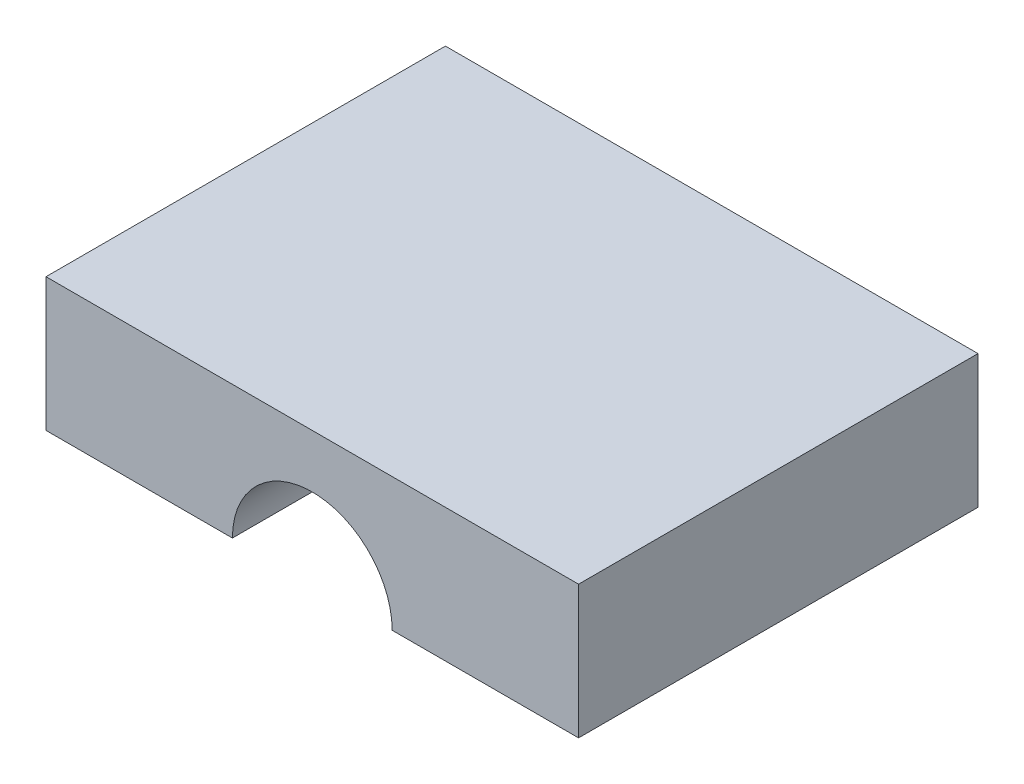
ISO-10303-21;
HEADER;
FILE_DESCRIPTION(('STEP AP214'),'2;1');
FILE_NAME('part.step','',(''),(''),'','','');
FILE_SCHEMA(('AUTOMOTIVE_DESIGN { 1 0 10303 214 1 1 1 1 }'));
ENDSEC;
DATA;
#1=APPLICATION_CONTEXT('core data for automotive mechanical design processes');
#2=APPLICATION_PROTOCOL_DEFINITION('international standard','automotive_design',2000,#1);
#3=PRODUCT_CONTEXT('',#1,'mechanical');
#4=PRODUCT('Part','Part','',(#3));
#5=PRODUCT_RELATED_PRODUCT_CATEGORY('part','',(#4));
#6=PRODUCT_DEFINITION_FORMATION('','',#4);
#7=PRODUCT_DEFINITION_CONTEXT('part definition',#1,'design');
#8=PRODUCT_DEFINITION('design','',#6,#7);
#9=PRODUCT_DEFINITION_SHAPE('','',#8);
#10=(LENGTH_UNIT() NAMED_UNIT(*) SI_UNIT(.MILLI.,.METRE.));
#11=(NAMED_UNIT(*) PLANE_ANGLE_UNIT() SI_UNIT($,.RADIAN.));
#12=(NAMED_UNIT(*) SI_UNIT($,.STERADIAN.) SOLID_ANGLE_UNIT());
#13=UNCERTAINTY_MEASURE_WITH_UNIT(LENGTH_MEASURE(1.E-05),#10,'distance_accuracy_value','');
#14=(GEOMETRIC_REPRESENTATION_CONTEXT(3) GLOBAL_UNCERTAINTY_ASSIGNED_CONTEXT((#13)) GLOBAL_UNIT_ASSIGNED_CONTEXT((#10,
#11,#12)) REPRESENTATION_CONTEXT('',''));
#15=CARTESIAN_POINT('',(0.,0.,0.));
#16=DIRECTION('',(0.,0.,1.));
#17=DIRECTION('',(1.,0.,0.));
#18=AXIS2_PLACEMENT_3D('',#15,#16,#17);
#19=CARTESIAN_POINT('',(0.,0.,0.));
#20=DIRECTION('',(0.,-1.,0.));
#21=DIRECTION('',(0.,0.,-1.));
#22=AXIS2_PLACEMENT_3D('',#19,#20,#21);
#23=PLANE('',#22);
#24=DIRECTION('',(0.,0.,1.));
#25=VECTOR('',#24,1.);
#26=CARTESIAN_POINT('',(26.,0.,-30.));
#27=LINE('',#26,#25);
#28=CARTESIAN_POINT('',(26.,0.,-30.));
#29=VERTEX_POINT('',#28);
#30=CARTESIAN_POINT('',(26.,0.,0.));
#31=VERTEX_POINT('',#30);
#32=EDGE_CURVE('E107',#29,#31,#27,.T.);
#33=ORIENTED_EDGE('',*,*,#32,.F.);
#34=DIRECTION('',(-1.,0.,0.));
#35=VECTOR('',#34,1.);
#36=CARTESIAN_POINT('',(0.,0.,-30.));
#37=LINE('',#36,#35);
#38=CARTESIAN_POINT('',(40.,0.,-30.));
#39=VERTEX_POINT('',#38);
#40=EDGE_CURVE('E113',#39,#29,#37,.T.);
#41=ORIENTED_EDGE('',*,*,#40,.F.);
#42=DIRECTION('',(0.,0.,-1.));
#43=VECTOR('',#42,1.);
#44=CARTESIAN_POINT('',(40.,0.,0.));
#45=LINE('',#44,#43);
#46=CARTESIAN_POINT('',(40.,0.,0.));
#47=VERTEX_POINT('',#46);
#48=EDGE_CURVE('E119',#47,#39,#45,.T.);
#49=ORIENTED_EDGE('',*,*,#48,.F.);
#50=DIRECTION('',(1.,0.,0.));
#51=VECTOR('',#50,1.);
#52=CARTESIAN_POINT('',(0.,0.,0.));
#53=LINE('',#52,#51);
#54=EDGE_CURVE('E138',#31,#47,#53,.T.);
#55=ORIENTED_EDGE('',*,*,#54,.F.);
#56=EDGE_LOOP('',(#33,#41,#49,#55));
#57=FACE_BOUND('',#56,.T.);
#58=ADVANCED_FACE('F42',(#57),#23,.T.);
#59=CARTESIAN_POINT('',(0.,10.,0.));
#60=DIRECTION('',(1.,0.,0.));
#61=DIRECTION('',(0.,0.,-1.));
#62=AXIS2_PLACEMENT_3D('',#59,#60,#61);
#63=PLANE('',#62);
#64=DIRECTION('',(0.,0.,1.));
#65=VECTOR('',#64,1.);
#66=CARTESIAN_POINT('',(0.,0.,0.));
#67=LINE('',#66,#65);
#68=CARTESIAN_POINT('',(0.,0.,-30.));
#69=VERTEX_POINT('',#68);
#70=CARTESIAN_POINT('',(0.,0.,0.));
#71=VERTEX_POINT('',#70);
#72=EDGE_CURVE('E118',#69,#71,#67,.T.);
#73=ORIENTED_EDGE('',*,*,#72,.T.);
#74=DIRECTION('',(0.,-1.,0.));
#75=VECTOR('',#74,1.);
#76=CARTESIAN_POINT('',(0.,10.,0.));
#77=LINE('',#76,#75);
#78=CARTESIAN_POINT('',(0.,10.,0.));
#79=VERTEX_POINT('',#78);
#80=EDGE_CURVE('E11',#79,#71,#77,.T.);
#81=ORIENTED_EDGE('',*,*,#80,.F.);
#82=DIRECTION('',(0.,0.,1.));
#83=VECTOR('',#82,1.);
#84=CARTESIAN_POINT('',(0.,10.,0.));
#85=LINE('',#84,#83);
#86=CARTESIAN_POINT('',(0.,10.,-30.));
#87=VERTEX_POINT('',#86);
#88=EDGE_CURVE('E121',#87,#79,#85,.T.);
#89=ORIENTED_EDGE('',*,*,#88,.F.);
#90=DIRECTION('',(0.,-1.,0.));
#91=VECTOR('',#90,1.);
#92=CARTESIAN_POINT('',(0.,10.,-30.));
#93=LINE('',#92,#91);
#94=EDGE_CURVE('E126',#87,#69,#93,.T.);
#95=ORIENTED_EDGE('',*,*,#94,.T.);
#96=EDGE_LOOP('',(#73,#81,#89,#95));
#97=FACE_BOUND('',#96,.T.);
#98=ADVANCED_FACE('F44',(#97),#63,.F.);
#99=CARTESIAN_POINT('',(0.,10.,0.));
#100=DIRECTION('',(0.,0.,-1.));
#101=DIRECTION('',(-1.,0.,0.));
#102=AXIS2_PLACEMENT_3D('',#99,#100,#101);
#103=PLANE('',#102);
#104=CARTESIAN_POINT('',(14.,0.,0.));
#105=VERTEX_POINT('',#104);
#106=EDGE_CURVE('E122',#71,#105,#53,.T.);
#107=ORIENTED_EDGE('',*,*,#106,.T.);
#108=CARTESIAN_POINT('',(20.,0.,0.));
#109=DIRECTION('',(0.,0.,1.));
#110=DIRECTION('',(-1.,0.,0.));
#111=AXIS2_PLACEMENT_3D('',#108,#109,#110);
#112=CIRCLE('',#111,6.);
#113=EDGE_CURVE('E57',#31,#105,#112,.T.);
#114=ORIENTED_EDGE('',*,*,#113,.F.);
#115=ORIENTED_EDGE('',*,*,#54,.T.);
#116=DIRECTION('',(0.,-1.,0.));
#117=VECTOR('',#116,1.);
#118=CARTESIAN_POINT('',(40.,10.,0.));
#119=LINE('',#118,#117);
#120=CARTESIAN_POINT('',(40.,10.,0.));
#121=VERTEX_POINT('',#120);
#122=EDGE_CURVE('E50',#121,#47,#119,.T.);
#123=ORIENTED_EDGE('',*,*,#122,.F.);
#124=DIRECTION('',(1.,0.,0.));
#125=VECTOR('',#124,1.);
#126=CARTESIAN_POINT('',(0.,10.,0.));
#127=LINE('',#126,#125);
#128=EDGE_CURVE('E94',#79,#121,#127,.T.);
#129=ORIENTED_EDGE('',*,*,#128,.F.);
#130=ORIENTED_EDGE('',*,*,#80,.T.);
#131=EDGE_LOOP('',(#107,#114,#115,#123,#129,#130));
#132=FACE_BOUND('',#131,.T.);
#133=ADVANCED_FACE('F146',(#132),#103,.F.);
#134=CARTESIAN_POINT('',(40.,10.,0.));
#135=DIRECTION('',(-1.,0.,0.));
#136=DIRECTION('',(0.,0.,1.));
#137=AXIS2_PLACEMENT_3D('',#134,#135,#136);
#138=PLANE('',#137);
#139=ORIENTED_EDGE('',*,*,#48,.T.);
#140=DIRECTION('',(0.,-1.,0.));
#141=VECTOR('',#140,1.);
#142=CARTESIAN_POINT('',(40.,10.,-30.));
#143=LINE('',#142,#141);
#144=CARTESIAN_POINT('',(40.,10.,-30.));
#145=VERTEX_POINT('',#144);
#146=EDGE_CURVE('E128',#145,#39,#143,.T.);
#147=ORIENTED_EDGE('',*,*,#146,.F.);
#148=DIRECTION('',(0.,0.,-1.));
#149=VECTOR('',#148,1.);
#150=CARTESIAN_POINT('',(40.,10.,0.));
#151=LINE('',#150,#149);
#152=EDGE_CURVE('E135',#121,#145,#151,.T.);
#153=ORIENTED_EDGE('',*,*,#152,.F.);
#154=ORIENTED_EDGE('',*,*,#122,.T.);
#155=EDGE_LOOP('',(#139,#147,#153,#154));
#156=FACE_BOUND('',#155,.T.);
#157=ADVANCED_FACE('F133',(#156),#138,.F.);
#158=CARTESIAN_POINT('',(0.,10.,-30.));
#159=DIRECTION('',(0.,0.,1.));
#160=DIRECTION('',(1.,0.,0.));
#161=AXIS2_PLACEMENT_3D('',#158,#159,#160);
#162=PLANE('',#161);
#163=ORIENTED_EDGE('',*,*,#40,.T.);
#164=CARTESIAN_POINT('',(20.,0.,-30.));
#165=DIRECTION('',(0.,0.,1.));
#166=DIRECTION('',(-1.,0.,0.));
#167=AXIS2_PLACEMENT_3D('',#164,#165,#166);
#168=CIRCLE('',#167,6.);
#169=CARTESIAN_POINT('',(14.,0.,-30.));
#170=VERTEX_POINT('',#169);
#171=EDGE_CURVE('E103',#29,#170,#168,.T.);
#172=ORIENTED_EDGE('',*,*,#171,.T.);
#173=EDGE_CURVE('E87',#170,#69,#37,.T.);
#174=ORIENTED_EDGE('',*,*,#173,.T.);
#175=ORIENTED_EDGE('',*,*,#94,.F.);
#176=DIRECTION('',(-1.,0.,0.));
#177=VECTOR('',#176,1.);
#178=CARTESIAN_POINT('',(0.,10.,-30.));
#179=LINE('',#178,#177);
#180=EDGE_CURVE('E66',#145,#87,#179,.T.);
#181=ORIENTED_EDGE('',*,*,#180,.F.);
#182=ORIENTED_EDGE('',*,*,#146,.T.);
#183=EDGE_LOOP('',(#163,#172,#174,#175,#181,#182));
#184=FACE_BOUND('',#183,.T.);
#185=ADVANCED_FACE('F110',(#184),#162,.F.);
#186=CARTESIAN_POINT('',(0.,10.,0.));
#187=DIRECTION('',(0.,-1.,0.));
#188=DIRECTION('',(0.,0.,-1.));
#189=AXIS2_PLACEMENT_3D('',#186,#187,#188);
#190=PLANE('',#189);
#191=ORIENTED_EDGE('',*,*,#88,.T.);
#192=ORIENTED_EDGE('',*,*,#128,.T.);
#193=ORIENTED_EDGE('',*,*,#152,.T.);
#194=ORIENTED_EDGE('',*,*,#180,.T.);
#195=EDGE_LOOP('',(#191,#192,#193,#194));
#196=FACE_BOUND('',#195,.T.);
#197=ADVANCED_FACE('F163',(#196),#190,.F.);
#198=DIRECTION('',(0.,0.,1.));
#199=VECTOR('',#198,1.);
#200=CARTESIAN_POINT('',(14.,0.,-30.));
#201=LINE('',#200,#199);
#202=EDGE_CURVE('E101',#170,#105,#201,.T.);
#203=ORIENTED_EDGE('',*,*,#202,.T.);
#204=ORIENTED_EDGE('',*,*,#106,.F.);
#205=ORIENTED_EDGE('',*,*,#72,.F.);
#206=ORIENTED_EDGE('',*,*,#173,.F.);
#207=EDGE_LOOP('',(#203,#204,#205,#206));
#208=FACE_BOUND('',#207,.T.);
#209=ADVANCED_FACE('F116',(#208),#23,.T.);
#210=CARTESIAN_POINT('',(20.,0.,-30.));
#211=DIRECTION('',(0.,0.,1.));
#212=DIRECTION('',(1.,0.,0.));
#213=AXIS2_PLACEMENT_3D('',#210,#211,#212);
#214=CYLINDRICAL_SURFACE('',#213,6.);
#215=ORIENTED_EDGE('',*,*,#113,.T.);
#216=ORIENTED_EDGE('',*,*,#202,.F.);
#217=ORIENTED_EDGE('',*,*,#171,.F.);
#218=ORIENTED_EDGE('',*,*,#32,.T.);
#219=EDGE_LOOP('',(#215,#216,#217,#218));
#220=FACE_BOUND('',#219,.T.);
#221=ADVANCED_FACE('F102',(#220),#214,.F.);
#222=CLOSED_SHELL('',(#58,#98,#133,#157,#185,#197,#209,#221));
#223=MANIFOLD_SOLID_BREP('B2',#222);
#224=ADVANCED_BREP_SHAPE_REPRESENTATION('',(#18,#223),#14);
#225=SHAPE_DEFINITION_REPRESENTATION(#9,#224);
ENDSEC;
END-ISO-10303-21;
